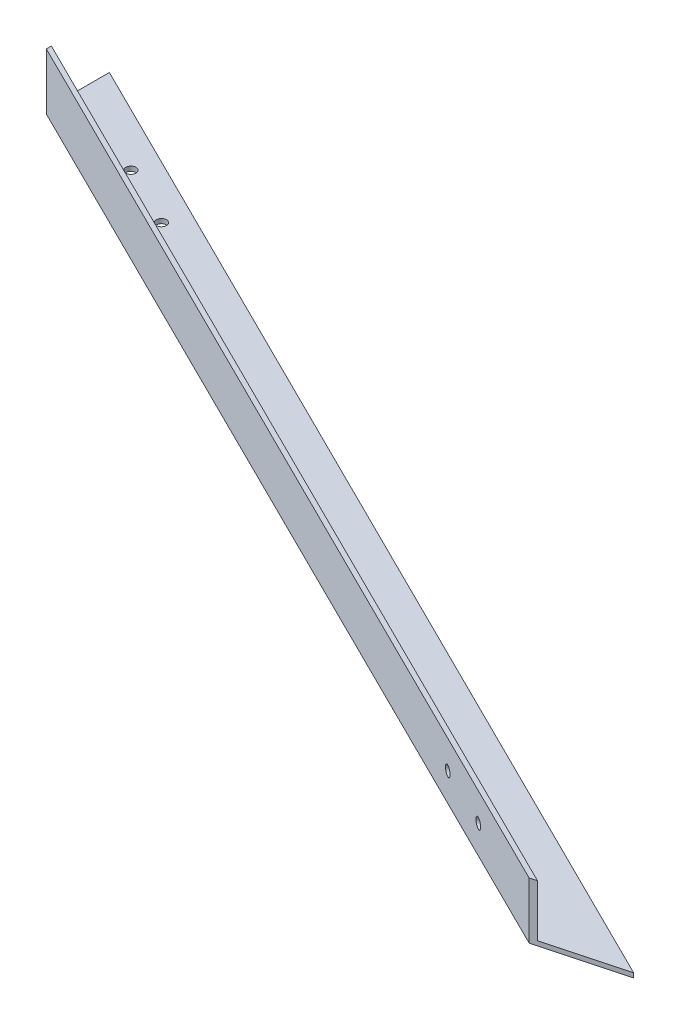
ISO-10303-21;
HEADER;
FILE_DESCRIPTION(('STEP AP214'),'2;1');
FILE_NAME('part.step','',(''),(''),'','','');
FILE_SCHEMA(('AUTOMOTIVE_DESIGN { 1 0 10303 214 1 1 1 1 }'));
ENDSEC;
DATA;
#1=APPLICATION_CONTEXT('core data for automotive mechanical design processes');
#2=APPLICATION_PROTOCOL_DEFINITION('international standard','automotive_design',2000,#1);
#3=PRODUCT_CONTEXT('',#1,'mechanical');
#4=PRODUCT('Part','Part','',(#3));
#5=PRODUCT_RELATED_PRODUCT_CATEGORY('part','',(#4));
#6=PRODUCT_DEFINITION_FORMATION('','',#4);
#7=PRODUCT_DEFINITION_CONTEXT('part definition',#1,'design');
#8=PRODUCT_DEFINITION('design','',#6,#7);
#9=PRODUCT_DEFINITION_SHAPE('','',#8);
#10=(LENGTH_UNIT() NAMED_UNIT(*) SI_UNIT(.MILLI.,.METRE.));
#11=(NAMED_UNIT(*) PLANE_ANGLE_UNIT() SI_UNIT($,.RADIAN.));
#12=(NAMED_UNIT(*) SI_UNIT($,.STERADIAN.) SOLID_ANGLE_UNIT());
#13=UNCERTAINTY_MEASURE_WITH_UNIT(LENGTH_MEASURE(1.E-05),#10,'distance_accuracy_value','');
#14=(GEOMETRIC_REPRESENTATION_CONTEXT(3) GLOBAL_UNCERTAINTY_ASSIGNED_CONTEXT((#13)) GLOBAL_UNIT_ASSIGNED_CONTEXT((#10,
#11,#12)) REPRESENTATION_CONTEXT('',''));
#15=CARTESIAN_POINT('',(0.,0.,0.));
#16=DIRECTION('',(0.,0.,1.));
#17=DIRECTION('',(1.,0.,0.));
#18=AXIS2_PLACEMENT_3D('',#15,#16,#17);
#19=CARTESIAN_POINT('',(134.54864533358,1979.1,1914.503823179));
#20=DIRECTION('',(0.,1.,0.));
#21=DIRECTION('',(0.895586037746255,0.,0.444888355651126));
#22=AXIS2_PLACEMENT_3D('',#19,#20,#21);
#23=CYLINDRICAL_SURFACE('',#22,4.5);
#24=CARTESIAN_POINT('',(134.54864533358,1979.,1914.503823179));
#25=DIRECTION('',(0.,1.,0.));
#26=DIRECTION('',(0.895586037746255,0.,0.444888355651126));
#27=AXIS2_PLACEMENT_3D('',#24,#25,#26);
#28=CIRCLE('',#27,4.5);
#29=CARTESIAN_POINT('',(138.57878250344,1979.,1916.50582078));
#30=VERTEX_POINT('',#29);
#31=EDGE_CURVE('E134',#30,#30,#28,.T.);
#32=ORIENTED_EDGE('',*,*,#31,.T.);
#33=DIRECTION('',(0.,-1.,0.));
#34=VECTOR('',#33,1.);
#35=CARTESIAN_POINT('',(138.57878250344,1979.1,1916.50582078));
#36=LINE('',#35,#34);
#37=CARTESIAN_POINT('',(138.57878250344,1975.,1916.50582078));
#38=VERTEX_POINT('',#37);
#39=EDGE_CURVE('E11',#30,#38,#36,.T.);
#40=ORIENTED_EDGE('',*,*,#39,.T.);
#41=CARTESIAN_POINT('',(134.54864533358,1975.,1914.503823179));
#42=DIRECTION('',(0.,1.,0.));
#43=DIRECTION('',(0.895586037746255,0.,0.444888355651126));
#44=AXIS2_PLACEMENT_3D('',#41,#42,#43);
#45=CIRCLE('',#44,4.5);
#46=EDGE_CURVE('E156',#38,#38,#45,.T.);
#47=ORIENTED_EDGE('',*,*,#46,.F.);
#48=ORIENTED_EDGE('',*,*,#39,.F.);
#49=EDGE_LOOP('',(#32,#40,#47,#48));
#50=FACE_BOUND('',#49,.T.);
#51=ADVANCED_FACE('F17',(#50),#23,.F.);
#52=CARTESIAN_POINT('',(188.28380759836,1979.1,1941.197124518));
#53=DIRECTION('',(0.,1.,0.));
#54=DIRECTION('',(0.895586037746255,0.,0.444888355651126));
#55=AXIS2_PLACEMENT_3D('',#52,#53,#54);
#56=CYLINDRICAL_SURFACE('',#55,4.5);
#57=CARTESIAN_POINT('',(188.28380759836,1979.,1941.197124518));
#58=DIRECTION('',(0.,1.,0.));
#59=DIRECTION('',(0.895586037746255,0.,0.444888355651126));
#60=AXIS2_PLACEMENT_3D('',#57,#58,#59);
#61=CIRCLE('',#60,4.5);
#62=CARTESIAN_POINT('',(192.31394476822,1979.,1943.199122119));
#63=VERTEX_POINT('',#62);
#64=EDGE_CURVE('E131',#63,#63,#61,.T.);
#65=ORIENTED_EDGE('',*,*,#64,.T.);
#66=DIRECTION('',(0.,-1.,0.));
#67=VECTOR('',#66,1.);
#68=CARTESIAN_POINT('',(192.31394476822,1979.1,1943.199122119));
#69=LINE('',#68,#67);
#70=CARTESIAN_POINT('',(192.31394476822,1975.,1943.199122119));
#71=VERTEX_POINT('',#70);
#72=EDGE_CURVE('E27',#63,#71,#69,.T.);
#73=ORIENTED_EDGE('',*,*,#72,.T.);
#74=CARTESIAN_POINT('',(188.28380759836,1975.,1941.197124518));
#75=DIRECTION('',(0.,1.,0.));
#76=DIRECTION('',(0.895586037746255,0.,0.444888355651126));
#77=AXIS2_PLACEMENT_3D('',#74,#75,#76);
#78=CIRCLE('',#77,4.5);
#79=EDGE_CURVE('E161',#71,#71,#78,.T.);
#80=ORIENTED_EDGE('',*,*,#79,.F.);
#81=ORIENTED_EDGE('',*,*,#72,.F.);
#82=EDGE_LOOP('',(#65,#73,#80,#81));
#83=FACE_BOUND('',#82,.T.);
#84=ADVANCED_FACE('F19',(#83),#56,.F.);
#85=CARTESIAN_POINT('',(-45.54251556488,1979.,1801.594000809));
#86=DIRECTION('',(0.444888355651126,0.,-0.895586037746255));
#87=DIRECTION('',(0.,-1.,0.));
#88=AXIS2_PLACEMENT_3D('',#85,#86,#87);
#89=PLANE('',#88);
#90=DIRECTION('',(0.,-1.,0.));
#91=VECTOR('',#90,1.);
#92=CARTESIAN_POINT('',(50.,1989.5,1849.055384588));
#93=LINE('',#92,#91);
#94=CARTESIAN_POINT('',(50.,1979.,1849.055384588));
#95=VERTEX_POINT('',#94);
#96=CARTESIAN_POINT('',(50.,1975.,1849.055384588));
#97=VERTEX_POINT('',#96);
#98=EDGE_CURVE('E166',#95,#97,#93,.T.);
#99=ORIENTED_EDGE('',*,*,#98,.F.);
#100=DIRECTION('',(0.895586037746255,0.,0.444888355651126));
#101=VECTOR('',#100,1.);
#102=CARTESIAN_POINT('',(-45.54251556488,1979.,1801.594000809));
#103=LINE('',#102,#101);
#104=CARTESIAN_POINT('',(973.00763146012,1979.,2307.565600364));
#105=VERTEX_POINT('',#104);
#106=EDGE_CURVE('E123',#95,#105,#103,.T.);
#107=ORIENTED_EDGE('',*,*,#106,.T.);
#108=DIRECTION('',(0.,1.,0.));
#109=VECTOR('',#108,1.);
#110=CARTESIAN_POINT('',(973.00763146012,989.5,2307.565600364));
#111=LINE('',#110,#109);
#112=CARTESIAN_POINT('',(973.00763146012,1975.,2307.565600364));
#113=VERTEX_POINT('',#112);
#114=EDGE_CURVE('E178',#113,#105,#111,.T.);
#115=ORIENTED_EDGE('',*,*,#114,.F.);
#116=DIRECTION('',(0.895586037746255,0.,0.444888355651126));
#117=VECTOR('',#116,1.);
#118=CARTESIAN_POINT('',(-45.54251556488,1975.,1801.594000809));
#119=LINE('',#118,#117);
#120=EDGE_CURVE('E165',#97,#113,#119,.T.);
#121=ORIENTED_EDGE('',*,*,#120,.F.);
#122=EDGE_LOOP('',(#99,#107,#115,#121));
#123=FACE_BOUND('',#122,.T.);
#124=ADVANCED_FACE('F261',(#123),#89,.T.);
#125=CARTESIAN_POINT('',(-66.00737992483,1979.,1842.790958545));
#126=DIRECTION('',(0.,1.,0.));
#127=DIRECTION('',(1.,0.,0.));
#128=AXIS2_PLACEMENT_3D('',#125,#126,#127);
#129=PLANE('',#128);
#130=ORIENTED_EDGE('',*,*,#31,.F.);
#131=EDGE_LOOP('',(#130));
#132=FACE_BOUND('',#131,.T.);
#133=ORIENTED_EDGE('',*,*,#64,.F.);
#134=EDGE_LOOP('',(#133));
#135=FACE_BOUND('',#134,.T.);
#136=DIRECTION('',(0.,0.,-1.));
#137=VECTOR('',#136,1.);
#138=CARTESIAN_POINT('',(50.,1979.,1873.837854183));
#139=LINE('',#138,#137);
#140=CARTESIAN_POINT('',(50.,1979.,1900.418400603));
#141=VERTEX_POINT('',#140);
#142=EDGE_CURVE('E171',#141,#95,#139,.T.);
#143=ORIENTED_EDGE('',*,*,#142,.F.);
#144=DIRECTION('',(0.895586037746255,0.,0.444888355651126));
#145=VECTOR('',#144,1.);
#146=CARTESIAN_POINT('',(-66.00737992483,1979.,1842.790958545));
#147=LINE('',#146,#145);
#148=CARTESIAN_POINT('',(905.84061051681,1979.,2325.562949384));
#149=VERTEX_POINT('',#148);
#150=EDGE_CURVE('E118',#141,#149,#147,.T.);
#151=ORIENTED_EDGE('',*,*,#150,.T.);
#152=DIRECTION('',(-0.965925826288944,0.,0.258819045102985));
#153=VECTOR('',#152,1.);
#154=CARTESIAN_POINT('',(36.535125597531,1979.,2558.492652044));
#155=LINE('',#154,#153);
#156=EDGE_CURVE('E182',#105,#149,#155,.T.);
#157=ORIENTED_EDGE('',*,*,#156,.F.);
#158=ORIENTED_EDGE('',*,*,#106,.F.);
#159=EDGE_LOOP('',(#143,#151,#157,#158));
#160=FACE_BOUND('',#159,.T.);
#161=ADVANCED_FACE('F271',(#132,#135,#160),#129,.T.);
#162=CARTESIAN_POINT('',(-66.00737992483,2025.,1842.790958545));
#163=DIRECTION('',(0.444888355651126,0.,-0.895586037746255));
#164=DIRECTION('',(0.,-1.,0.));
#165=AXIS2_PLACEMENT_3D('',#162,#163,#164);
#166=PLANE('',#165);
#167=CARTESIAN_POINT('',(758.48578738319,2000.,2252.3634552));
#168=DIRECTION('',(0.444888355651126,0.,-0.895586037746255));
#169=DIRECTION('',(0.895586037746255,0.,0.444888355651126));
#170=AXIS2_PLACEMENT_3D('',#167,#168,#169);
#171=CIRCLE('',#170,4.5);
#172=CARTESIAN_POINT('',(762.51592455305,2000.,2254.365452801));
#173=VERTEX_POINT('',#172);
#174=EDGE_CURVE('E114',#173,#173,#171,.T.);
#175=ORIENTED_EDGE('',*,*,#174,.F.);
#176=EDGE_LOOP('',(#175));
#177=FACE_BOUND('',#176,.T.);
#178=CARTESIAN_POINT('',(812.22094964797,2000.,2279.056756539));
#179=DIRECTION('',(0.444888355651126,0.,-0.895586037746255));
#180=DIRECTION('',(0.895586037746255,0.,0.444888355651126));
#181=AXIS2_PLACEMENT_3D('',#178,#179,#180);
#182=CIRCLE('',#181,4.5);
#183=CARTESIAN_POINT('',(816.25108681783,2000.,2281.05875414));
#184=VERTEX_POINT('',#183);
#185=EDGE_CURVE('E201',#184,#184,#182,.T.);
#186=ORIENTED_EDGE('',*,*,#185,.F.);
#187=EDGE_LOOP('',(#186));
#188=FACE_BOUND('',#187,.T.);
#189=DIRECTION('',(0.,-1.,0.));
#190=VECTOR('',#189,1.);
#191=CARTESIAN_POINT('',(50.,2012.5,1900.418400603));
#192=LINE('',#191,#190);
#193=CARTESIAN_POINT('',(50.,2025.,1900.418400603));
#194=VERTEX_POINT('',#193);
#195=EDGE_CURVE('E170',#194,#141,#192,.T.);
#196=ORIENTED_EDGE('',*,*,#195,.F.);
#197=DIRECTION('',(0.895586037746255,0.,0.444888355651126));
#198=VECTOR('',#197,1.);
#199=CARTESIAN_POINT('',(-66.00737992483,2025.,1842.790958545));
#200=LINE('',#199,#198);
#201=CARTESIAN_POINT('',(905.84061051681,2025.,2325.562949384));
#202=VERTEX_POINT('',#201);
#203=EDGE_CURVE('E183',#194,#202,#200,.T.);
#204=ORIENTED_EDGE('',*,*,#203,.T.);
#205=DIRECTION('',(0.,1.,0.));
#206=VECTOR('',#205,1.);
#207=CARTESIAN_POINT('',(905.84061051681,1012.5,2325.562949384));
#208=LINE('',#207,#206);
#209=EDGE_CURVE('E198',#149,#202,#208,.T.);
#210=ORIENTED_EDGE('',*,*,#209,.F.);
#211=ORIENTED_EDGE('',*,*,#150,.F.);
#212=EDGE_LOOP('',(#196,#204,#210,#211));
#213=FACE_BOUND('',#212,.T.);
#214=ADVANCED_FACE('F275',(#177,#188,#213),#166,.T.);
#215=CARTESIAN_POINT('',(758.53027621876,2000.,2252.273896596));
#216=DIRECTION('',(0.444888355651126,0.,-0.895586037746255));
#217=DIRECTION('',(0.895586037746255,0.,0.444888355651126));
#218=AXIS2_PLACEMENT_3D('',#215,#216,#217);
#219=CYLINDRICAL_SURFACE('',#218,4.5);
#220=ORIENTED_EDGE('',*,*,#174,.T.);
#221=DIRECTION('',(-0.444888355651126,0.,0.895586037746255));
#222=VECTOR('',#221,1.);
#223=CARTESIAN_POINT('',(762.56041338862,2000.,2254.275894197));
#224=LINE('',#223,#222);
#225=CARTESIAN_POINT('',(760.73637113045,2000.,2257.947796952));
#226=VERTEX_POINT('',#225);
#227=EDGE_CURVE('E111',#173,#226,#224,.T.);
#228=ORIENTED_EDGE('',*,*,#227,.T.);
#229=CARTESIAN_POINT('',(756.70623396059,2000.,2255.945799351));
#230=DIRECTION('',(0.444888355651126,0.,-0.895586037746255));
#231=DIRECTION('',(0.895586037746255,0.,0.444888355651126));
#232=AXIS2_PLACEMENT_3D('',#229,#230,#231);
#233=CIRCLE('',#232,4.5);
#234=EDGE_CURVE('E116',#226,#226,#233,.T.);
#235=ORIENTED_EDGE('',*,*,#234,.F.);
#236=ORIENTED_EDGE('',*,*,#227,.F.);
#237=EDGE_LOOP('',(#220,#228,#235,#236));
#238=FACE_BOUND('',#237,.T.);
#239=ADVANCED_FACE('F112',(#238),#219,.F.);
#240=CARTESIAN_POINT('',(812.26543848354,2000.,2278.967197935));
#241=DIRECTION('',(0.444888355651126,0.,-0.895586037746255));
#242=DIRECTION('',(0.895586037746255,0.,0.444888355651126));
#243=AXIS2_PLACEMENT_3D('',#240,#241,#242);
#244=CYLINDRICAL_SURFACE('',#243,4.5);
#245=ORIENTED_EDGE('',*,*,#185,.T.);
#246=DIRECTION('',(-0.444888355651126,0.,0.895586037746255));
#247=VECTOR('',#246,1.);
#248=CARTESIAN_POINT('',(816.29557565339,2000.,2280.969195536));
#249=LINE('',#248,#247);
#250=CARTESIAN_POINT('',(814.47153339522,2000.,2284.641098291));
#251=VERTEX_POINT('',#250);
#252=EDGE_CURVE('E125',#184,#251,#249,.T.);
#253=ORIENTED_EDGE('',*,*,#252,.T.);
#254=CARTESIAN_POINT('',(810.44139622537,2000.,2282.63910069));
#255=DIRECTION('',(0.444888355651126,0.,-0.895586037746255));
#256=DIRECTION('',(0.895586037746255,0.,0.444888355651126));
#257=AXIS2_PLACEMENT_3D('',#254,#255,#256);
#258=CIRCLE('',#257,4.5);
#259=EDGE_CURVE('E150',#251,#251,#258,.T.);
#260=ORIENTED_EDGE('',*,*,#259,.F.);
#261=ORIENTED_EDGE('',*,*,#252,.F.);
#262=EDGE_LOOP('',(#245,#253,#260,#261));
#263=FACE_BOUND('',#262,.T.);
#264=ADVANCED_FACE('F208',(#263),#244,.F.);
#265=CARTESIAN_POINT('',(-46.716837641,0.,2580.799948362));
#266=DIRECTION('',(-0.258819045102985,0.,-0.965925826288944));
#267=DIRECTION('',(-0.965925826288944,0.,0.258819045102985));
#268=AXIS2_PLACEMENT_3D('',#265,#266,#267);
#269=PLANE('',#268);
#270=DIRECTION('',(0.965925826288944,0.,-0.258819045102985));
#271=VECTOR('',#270,1.);
#272=CARTESIAN_POINT('',(51.231734509738,1975.,2554.554707555));
#273=LINE('',#272,#271);
#274=CARTESIAN_POINT('',(900.,1975.,2327.127936255));
#275=VERTEX_POINT('',#274);
#276=EDGE_CURVE('E177',#275,#113,#273,.T.);
#277=ORIENTED_EDGE('',*,*,#276,.T.);
#278=ORIENTED_EDGE('',*,*,#114,.T.);
#279=ORIENTED_EDGE('',*,*,#156,.T.);
#280=ORIENTED_EDGE('',*,*,#209,.T.);
#281=DIRECTION('',(-0.965925826288944,0.,0.258819045102985));
#282=VECTOR('',#281,1.);
#283=CARTESIAN_POINT('',(35.257159605165,2025.,2558.835082));
#284=LINE('',#283,#282);
#285=CARTESIAN_POINT('',(900.,2025.,2327.127936255));
#286=VERTEX_POINT('',#285);
#287=EDGE_CURVE('E160',#202,#286,#284,.T.);
#288=ORIENTED_EDGE('',*,*,#287,.T.);
#289=DIRECTION('',(0.,-1.,0.));
#290=VECTOR('',#289,1.);
#291=CARTESIAN_POINT('',(900.,987.5,2327.127936255));
#292=LINE('',#291,#290);
#293=EDGE_CURVE('E232',#286,#275,#292,.T.);
#294=ORIENTED_EDGE('',*,*,#293,.T.);
#295=EDGE_LOOP('',(#277,#278,#279,#280,#288,#294));
#296=FACE_BOUND('',#295,.T.);
#297=ADVANCED_FACE('F254',(#296),#269,.F.);
#298=CARTESIAN_POINT('',(-67.78693334744,2025.,1846.373302696));
#299=DIRECTION('',(0.,1.,0.));
#300=DIRECTION('',(1.,0.,0.));
#301=AXIS2_PLACEMENT_3D('',#298,#299,#300);
#302=PLANE('',#301);
#303=DIRECTION('',(0.,0.,-1.));
#304=VECTOR('',#303,1.);
#305=CARTESIAN_POINT('',(50.,2025.,1875.629026259));
#306=LINE('',#305,#304);
#307=CARTESIAN_POINT('',(50.,2025.,1904.884749822));
#308=VERTEX_POINT('',#307);
#309=EDGE_CURVE('E155',#308,#194,#306,.T.);
#310=ORIENTED_EDGE('',*,*,#309,.F.);
#311=DIRECTION('',(0.895586037746255,0.,0.444888355651126));
#312=VECTOR('',#311,1.);
#313=CARTESIAN_POINT('',(-67.78693334744,2025.,1846.373302696));
#314=LINE('',#313,#312);
#315=EDGE_CURVE('E148',#308,#286,#314,.T.);
#316=ORIENTED_EDGE('',*,*,#315,.T.);
#317=ORIENTED_EDGE('',*,*,#287,.F.);
#318=ORIENTED_EDGE('',*,*,#203,.F.);
#319=EDGE_LOOP('',(#310,#316,#317,#318));
#320=FACE_BOUND('',#319,.T.);
#321=ADVANCED_FACE('F244',(#320),#302,.T.);
#322=CARTESIAN_POINT('',(-45.54251556488,1975.,1801.594000809));
#323=DIRECTION('',(0.,-1.,0.));
#324=DIRECTION('',(0.,0.,-1.));
#325=AXIS2_PLACEMENT_3D('',#322,#323,#324);
#326=PLANE('',#325);
#327=ORIENTED_EDGE('',*,*,#46,.T.);
#328=EDGE_LOOP('',(#327));
#329=FACE_BOUND('',#328,.T.);
#330=ORIENTED_EDGE('',*,*,#79,.T.);
#331=EDGE_LOOP('',(#330));
#332=FACE_BOUND('',#331,.T.);
#333=DIRECTION('',(0.,0.,1.));
#334=VECTOR('',#333,1.);
#335=CARTESIAN_POINT('',(50.,1975.,1853.239375315));
#336=LINE('',#335,#334);
#337=CARTESIAN_POINT('',(50.,1975.,1904.884749822));
#338=VERTEX_POINT('',#337);
#339=EDGE_CURVE('E162',#97,#338,#336,.T.);
#340=ORIENTED_EDGE('',*,*,#339,.F.);
#341=ORIENTED_EDGE('',*,*,#120,.T.);
#342=ORIENTED_EDGE('',*,*,#276,.F.);
#343=DIRECTION('',(0.895586037746255,0.,0.444888355651126));
#344=VECTOR('',#343,1.);
#345=CARTESIAN_POINT('',(-67.78693334744,1975.,1846.373302696));
#346=LINE('',#345,#344);
#347=EDGE_CURVE('E224',#338,#275,#346,.T.);
#348=ORIENTED_EDGE('',*,*,#347,.F.);
#349=EDGE_LOOP('',(#340,#341,#342,#348));
#350=FACE_BOUND('',#349,.T.);
#351=ADVANCED_FACE('F258',(#329,#332,#350),#326,.T.);
#352=CARTESIAN_POINT('',(50.,2000.,1904.884749822));
#353=DIRECTION('',(1.,0.,0.));
#354=DIRECTION('',(0.,1.,0.));
#355=AXIS2_PLACEMENT_3D('',#352,#353,#354);
#356=PLANE('',#355);
#357=ORIENTED_EDGE('',*,*,#309,.T.);
#358=ORIENTED_EDGE('',*,*,#195,.T.);
#359=ORIENTED_EDGE('',*,*,#142,.T.);
#360=ORIENTED_EDGE('',*,*,#98,.T.);
#361=ORIENTED_EDGE('',*,*,#339,.T.);
#362=DIRECTION('',(0.,1.,0.));
#363=VECTOR('',#362,1.);
#364=CARTESIAN_POINT('',(50.,1987.5,1904.884749822));
#365=LINE('',#364,#363);
#366=EDGE_CURVE('E221',#338,#308,#365,.T.);
#367=ORIENTED_EDGE('',*,*,#366,.T.);
#368=EDGE_LOOP('',(#357,#358,#359,#360,#361,#367));
#369=FACE_BOUND('',#368,.T.);
#370=ADVANCED_FACE('F214',(#369),#356,.F.);
#371=CARTESIAN_POINT('',(-67.78693334744,1975.,1846.373302696));
#372=DIRECTION('',(-0.444888355651126,0.,0.895586037746255));
#373=DIRECTION('',(0.,1.,0.));
#374=AXIS2_PLACEMENT_3D('',#371,#372,#373);
#375=PLANE('',#374);
#376=ORIENTED_EDGE('',*,*,#234,.T.);
#377=EDGE_LOOP('',(#376));
#378=FACE_BOUND('',#377,.T.);
#379=ORIENTED_EDGE('',*,*,#259,.T.);
#380=EDGE_LOOP('',(#379));
#381=FACE_BOUND('',#380,.T.);
#382=ORIENTED_EDGE('',*,*,#366,.F.);
#383=ORIENTED_EDGE('',*,*,#347,.T.);
#384=ORIENTED_EDGE('',*,*,#293,.F.);
#385=ORIENTED_EDGE('',*,*,#315,.F.);
#386=EDGE_LOOP('',(#382,#383,#384,#385));
#387=FACE_BOUND('',#386,.T.);
#388=ADVANCED_FACE('F211',(#378,#381,#387),#375,.T.);
#389=CLOSED_SHELL('',(#51,#84,#124,#161,#214,#239,#264,#297,#321,#351,#370,#388));
#390=MANIFOLD_SOLID_BREP('B1',#389);
#391=ADVANCED_BREP_SHAPE_REPRESENTATION('',(#18,#390),#14);
#392=SHAPE_DEFINITION_REPRESENTATION(#9,#391);
ENDSEC;
END-ISO-10303-21;
